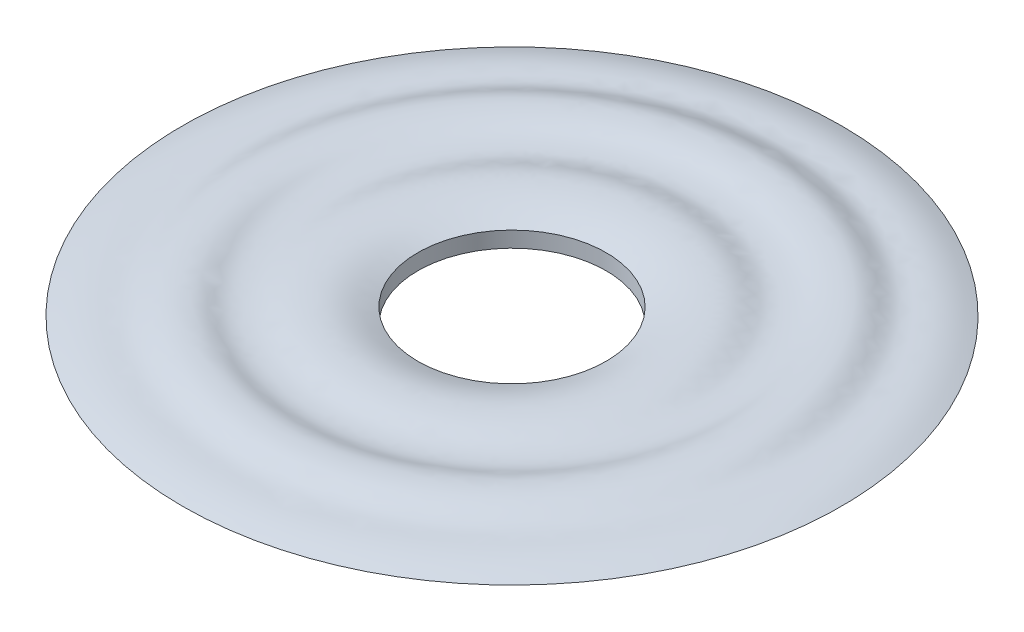
ISO-10303-21;
HEADER;
FILE_DESCRIPTION(('STEP AP214'),'2;1');
FILE_NAME('part.step','',(''),(''),'','','');
FILE_SCHEMA(('AUTOMOTIVE_DESIGN { 1 0 10303 214 1 1 1 1 }'));
ENDSEC;
DATA;
#1=APPLICATION_CONTEXT('core data for automotive mechanical design processes');
#2=APPLICATION_PROTOCOL_DEFINITION('international standard','automotive_design',2000,#1);
#3=PRODUCT_CONTEXT('',#1,'mechanical');
#4=PRODUCT('Part','Part','',(#3));
#5=PRODUCT_RELATED_PRODUCT_CATEGORY('part','',(#4));
#6=PRODUCT_DEFINITION_FORMATION('','',#4);
#7=PRODUCT_DEFINITION_CONTEXT('part definition',#1,'design');
#8=PRODUCT_DEFINITION('design','',#6,#7);
#9=PRODUCT_DEFINITION_SHAPE('','',#8);
#10=(LENGTH_UNIT() NAMED_UNIT(*) SI_UNIT(.MILLI.,.METRE.));
#11=(NAMED_UNIT(*) PLANE_ANGLE_UNIT() SI_UNIT($,.RADIAN.));
#12=(NAMED_UNIT(*) SI_UNIT($,.STERADIAN.) SOLID_ANGLE_UNIT());
#13=UNCERTAINTY_MEASURE_WITH_UNIT(LENGTH_MEASURE(1.E-05),#10,'distance_accuracy_value','');
#14=(GEOMETRIC_REPRESENTATION_CONTEXT(3) GLOBAL_UNCERTAINTY_ASSIGNED_CONTEXT((#13)) GLOBAL_UNIT_ASSIGNED_CONTEXT((#10,
#11,#12)) REPRESENTATION_CONTEXT('',''));
#15=CARTESIAN_POINT('',(0.,0.,0.));
#16=DIRECTION('',(0.,0.,1.));
#17=DIRECTION('',(1.,0.,0.));
#18=AXIS2_PLACEMENT_3D('',#15,#16,#17);
#19=CARTESIAN_POINT('',(126.,0.,0.));
#20=CARTESIAN_POINT('',(121.796433134029,1.48898187192959,0.));
#21=CARTESIAN_POINT('',(116.689065097714,3.29810699395562,0.));
#22=CARTESIAN_POINT('',(100.759507116548,2.72442872882737,0.));
#23=CARTESIAN_POINT('',(97.6501230058952,7.14442091724492,0.));
#24=CARTESIAN_POINT('',(81.4100624755401,6.9066156764814,0.));
#25=CARTESIAN_POINT('',(80.6398179174884,4.14267791256481,0.));
#26=CARTESIAN_POINT('',(65.8153843288371,3.84415720392554,0.));
#27=CARTESIAN_POINT('',(62.5042310472688,6.9880467906587,0.));
#28=CARTESIAN_POINT('',(46.2816207852884,7.05338108836043,0.));
#29=CARTESIAN_POINT('',(40.5852301313859,4.8076610184781,0.));
#30=CARTESIAN_POINT('',(36.,3.,0.));
#31=B_SPLINE_CURVE_WITH_KNOTS('',3,(#19,#20,#21,#22,#23,#24,#25,#26,#27,#28,#29,#30),
.UNSPECIFIED.,.F.,.F.,(4,1,1,1,1,1,1,1,1,4),(0.,0.204383547190415,0.248327677268362,
0.418206453722676,0.462801007657691,0.649678662683494,0.69074325607466,0.832382348178186,
0.865078511222014,1.),.UNSPECIFIED.);
#32=CARTESIAN_POINT('',(0.,2.61588062506354,0.));
#33=DIRECTION('',(0.,1.,0.));
#34=AXIS1_PLACEMENT('',#32,#33);
#35=SURFACE_OF_REVOLUTION('',#31,#34);
#36=CARTESIAN_POINT('',(0.,3.,0.));
#37=DIRECTION('',(0.,1.,0.));
#38=DIRECTION('',(0.,0.,1.));
#39=AXIS2_PLACEMENT_3D('',#36,#37,#38);
#40=CIRCLE('',#39,36.);
#41=CARTESIAN_POINT('',(0.,3.,36.));
#42=VERTEX_POINT('',#41);
#43=EDGE_CURVE('E10',#42,#42,#40,.T.);
#44=ORIENTED_EDGE('',*,*,#43,.F.);
#45=EDGE_LOOP('',(#44));
#46=FACE_BOUND('',#45,.T.);
#47=CARTESIAN_POINT('',(0.,0.,0.));
#48=DIRECTION('',(0.,1.,0.));
#49=DIRECTION('',(0.,0.,1.));
#50=AXIS2_PLACEMENT_3D('',#47,#48,#49);
#51=CIRCLE('',#50,126.);
#52=CARTESIAN_POINT('',(0.,0.,126.));
#53=VERTEX_POINT('',#52);
#54=EDGE_CURVE('E45',#53,#53,#51,.T.);
#55=ORIENTED_EDGE('',*,*,#54,.T.);
#56=EDGE_LOOP('',(#55));
#57=FACE_BOUND('',#56,.T.);
#58=ADVANCED_FACE('F34',(#46,#57),#35,.T.);
#59=CARTESIAN_POINT('',(0.,2.61588062506354,0.));
#60=DIRECTION('',(0.,1.,0.));
#61=DIRECTION('',(0.,0.,1.));
#62=AXIS2_PLACEMENT_3D('',#59,#60,#61);
#63=CYLINDRICAL_SURFACE('',#62,36.);
#64=CARTESIAN_POINT('',(0.,-3.,0.));
#65=DIRECTION('',(0.,1.,0.));
#66=DIRECTION('',(0.,0.,1.));
#67=AXIS2_PLACEMENT_3D('',#64,#65,#66);
#68=CIRCLE('',#67,36.);
#69=CARTESIAN_POINT('',(0.,-3.,36.));
#70=VERTEX_POINT('',#69);
#71=EDGE_CURVE('E41',#70,#70,#68,.T.);
#72=ORIENTED_EDGE('',*,*,#71,.F.);
#73=EDGE_LOOP('',(#72));
#74=FACE_BOUND('',#73,.T.);
#75=ORIENTED_EDGE('',*,*,#43,.T.);
#76=EDGE_LOOP('',(#75));
#77=FACE_BOUND('',#76,.T.);
#78=ADVANCED_FACE('F63',(#74,#77),#63,.F.);
#79=CARTESIAN_POINT('',(36.,-3.,0.));
#80=CARTESIAN_POINT('',(40.5852301313859,-4.8076610184781,0.));
#81=CARTESIAN_POINT('',(46.2816207852884,-7.05338108836043,0.));
#82=CARTESIAN_POINT('',(62.5042310472688,-6.98804679065871,0.));
#83=CARTESIAN_POINT('',(65.8153843288371,-3.84415720392554,0.));
#84=CARTESIAN_POINT('',(80.6398179174884,-4.14267791256481,0.));
#85=CARTESIAN_POINT('',(81.4100624755401,-6.9066156764814,0.));
#86=CARTESIAN_POINT('',(97.6501230058952,-7.14442091724492,0.));
#87=CARTESIAN_POINT('',(100.759507116548,-2.72442872882737,0.));
#88=CARTESIAN_POINT('',(116.689065097714,-3.29810699395562,0.));
#89=CARTESIAN_POINT('',(121.796433134029,-1.48898187192959,0.));
#90=CARTESIAN_POINT('',(126.,0.,0.));
#91=B_SPLINE_CURVE_WITH_KNOTS('',3,(#79,#80,#81,#82,#83,#84,#85,#86,#87,#88,#89,#90),
.UNSPECIFIED.,.F.,.F.,(4,1,1,1,1,1,1,1,1,4),(0.,0.134921488777986,0.167617651821814,
0.309256743925339,0.350321337316506,0.537198992342309,0.581793546277324,0.751672322731638,
0.795616452809585,1.),.UNSPECIFIED.);
#92=CARTESIAN_POINT('',(0.,2.61588062506354,0.));
#93=DIRECTION('',(0.,1.,0.));
#94=AXIS1_PLACEMENT('',#92,#93);
#95=SURFACE_OF_REVOLUTION('',#91,#94);
#96=ORIENTED_EDGE('',*,*,#54,.F.);
#97=EDGE_LOOP('',(#96));
#98=FACE_BOUND('',#97,.T.);
#99=ORIENTED_EDGE('',*,*,#71,.T.);
#100=EDGE_LOOP('',(#99));
#101=FACE_BOUND('',#100,.T.);
#102=ADVANCED_FACE('F61',(#98,#101),#95,.T.);
#103=CLOSED_SHELL('',(#58,#78,#102));
#104=MANIFOLD_SOLID_BREP('B2',#103);
#105=ADVANCED_BREP_SHAPE_REPRESENTATION('',(#18,#104),#14);
#106=SHAPE_DEFINITION_REPRESENTATION(#9,#105);
ENDSEC;
END-ISO-10303-21;
